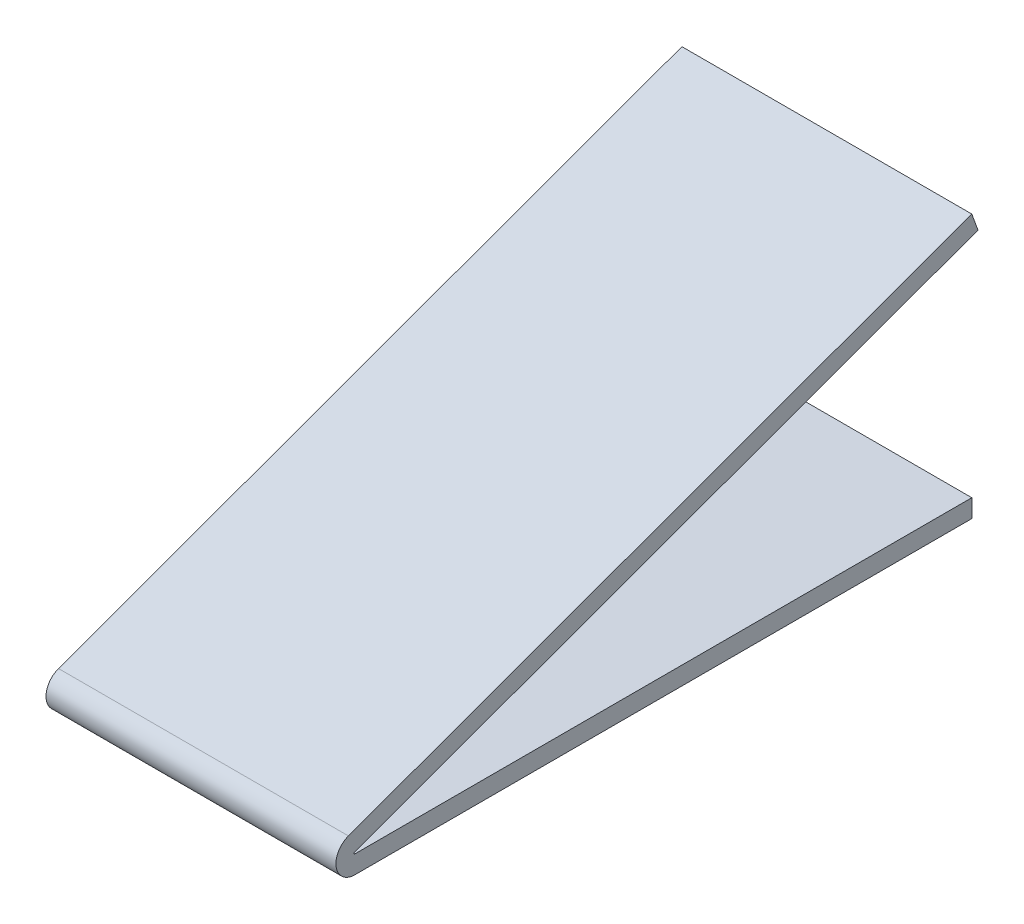
ISO-10303-21;
HEADER;
FILE_DESCRIPTION(('STEP AP214'),'2;1');
FILE_NAME('part.step','',(''),(''),'','','');
FILE_SCHEMA(('AUTOMOTIVE_DESIGN { 1 0 10303 214 1 1 1 1 }'));
ENDSEC;
DATA;
#1=APPLICATION_CONTEXT('core data for automotive mechanical design processes');
#2=APPLICATION_PROTOCOL_DEFINITION('international standard','automotive_design',2000,#1);
#3=PRODUCT_CONTEXT('',#1,'mechanical');
#4=PRODUCT('Part','Part','',(#3));
#5=PRODUCT_RELATED_PRODUCT_CATEGORY('part','',(#4));
#6=PRODUCT_DEFINITION_FORMATION('','',#4);
#7=PRODUCT_DEFINITION_CONTEXT('part definition',#1,'design');
#8=PRODUCT_DEFINITION('design','',#6,#7);
#9=PRODUCT_DEFINITION_SHAPE('','',#8);
#10=(LENGTH_UNIT() NAMED_UNIT(*) SI_UNIT(.MILLI.,.METRE.));
#11=(NAMED_UNIT(*) PLANE_ANGLE_UNIT() SI_UNIT($,.RADIAN.));
#12=(NAMED_UNIT(*) SI_UNIT($,.STERADIAN.) SOLID_ANGLE_UNIT());
#13=UNCERTAINTY_MEASURE_WITH_UNIT(LENGTH_MEASURE(1.E-05),#10,'distance_accuracy_value','');
#14=(GEOMETRIC_REPRESENTATION_CONTEXT(3) GLOBAL_UNCERTAINTY_ASSIGNED_CONTEXT((#13)) GLOBAL_UNIT_ASSIGNED_CONTEXT((#10,
#11,#12)) REPRESENTATION_CONTEXT('',''));
#15=CARTESIAN_POINT('',(0.,0.,0.));
#16=DIRECTION('',(0.,0.,1.));
#17=DIRECTION('',(1.,0.,0.));
#18=AXIS2_PLACEMENT_3D('',#15,#16,#17);
#19=CARTESIAN_POINT('',(8.,0.548492315519647,-2.96887245171615));
#20=DIRECTION('',(0.,0.939692620785908,0.342020143325669));
#21=DIRECTION('',(0.,-0.342020143325669,0.939692620785908));
#22=AXIS2_PLACEMENT_3D('',#19,#20,#21);
#23=PLANE('',#22);
#24=DIRECTION('',(0.,0.342020143325669,-0.939692620785908));
#25=VECTOR('',#24,1.);
#26=CARTESIAN_POINT('',(0.,0.548492315519647,-2.96887245171615));
#27=LINE('',#26,#25);
#28=CARTESIAN_POINT('',(0.,0.548492315519647,-2.96887245171615));
#29=VERTEX_POINT('',#28);
#30=CARTESIAN_POINT('',(0.,6.80955837493111,-20.1710100716628));
#31=VERTEX_POINT('',#30);
#32=EDGE_CURVE('E130',#29,#31,#27,.T.);
#33=ORIENTED_EDGE('',*,*,#32,.T.);
#34=DIRECTION('',(-1.,0.,0.));
#35=VECTOR('',#34,1.);
#36=CARTESIAN_POINT('',(8.,6.80955837493111,-20.1710100716628));
#37=LINE('',#36,#35);
#38=CARTESIAN_POINT('',(8.,6.80955837493111,-20.1710100716628));
#39=VERTEX_POINT('',#38);
#40=EDGE_CURVE('E11',#39,#31,#37,.T.);
#41=ORIENTED_EDGE('',*,*,#40,.F.);
#42=DIRECTION('',(0.,0.342020143325669,-0.939692620785908));
#43=VECTOR('',#42,1.);
#44=CARTESIAN_POINT('',(8.,0.548492315519647,-2.96887245171615));
#45=LINE('',#44,#43);
#46=CARTESIAN_POINT('',(8.,0.548492315519647,-2.96887245171615));
#47=VERTEX_POINT('',#46);
#48=EDGE_CURVE('E88',#47,#39,#45,.T.);
#49=ORIENTED_EDGE('',*,*,#48,.F.);
#50=DIRECTION('',(-1.,0.,0.));
#51=VECTOR('',#50,1.);
#52=CARTESIAN_POINT('',(8.,0.548492315519647,-2.96887245171615));
#53=LINE('',#52,#51);
#54=EDGE_CURVE('E129',#47,#29,#53,.T.);
#55=ORIENTED_EDGE('',*,*,#54,.T.);
#56=EDGE_LOOP('',(#33,#41,#49,#55));
#57=FACE_BOUND('',#56,.T.);
#58=ADVANCED_FACE('F33',(#57),#23,.F.);
#59=CARTESIAN_POINT('',(8.,7.27940468532406,-20.));
#60=DIRECTION('',(0.,0.342020143325676,-0.939692620785906));
#61=DIRECTION('',(0.,0.939692620785906,0.342020143325676));
#62=AXIS2_PLACEMENT_3D('',#59,#60,#61);
#63=PLANE('',#62);
#64=DIRECTION('',(0.,-0.939692620785906,-0.342020143325676));
#65=VECTOR('',#64,1.);
#66=CARTESIAN_POINT('',(0.,7.27940468532406,-20.));
#67=LINE('',#66,#65);
#68=CARTESIAN_POINT('',(0.,7.27940468532406,-20.));
#69=VERTEX_POINT('',#68);
#70=EDGE_CURVE('E133',#69,#31,#67,.T.);
#71=ORIENTED_EDGE('',*,*,#70,.F.);
#72=DIRECTION('',(-1.,0.,0.));
#73=VECTOR('',#72,1.);
#74=CARTESIAN_POINT('',(8.,7.27940468532406,-20.));
#75=LINE('',#74,#73);
#76=CARTESIAN_POINT('',(8.,7.27940468532406,-20.));
#77=VERTEX_POINT('',#76);
#78=EDGE_CURVE('E41',#77,#69,#75,.T.);
#79=ORIENTED_EDGE('',*,*,#78,.F.);
#80=DIRECTION('',(0.,-0.939692620785906,-0.342020143325676));
#81=VECTOR('',#80,1.);
#82=CARTESIAN_POINT('',(8.,7.27940468532406,-20.));
#83=LINE('',#82,#81);
#84=EDGE_CURVE('E172',#77,#39,#83,.T.);
#85=ORIENTED_EDGE('',*,*,#84,.T.);
#86=ORIENTED_EDGE('',*,*,#40,.T.);
#87=EDGE_LOOP('',(#71,#79,#85,#86));
#88=FACE_BOUND('',#87,.T.);
#89=ADVANCED_FACE('F163',(#88),#63,.T.);
#90=CARTESIAN_POINT('',(8.,1.0183386259126,-2.79786238005331));
#91=DIRECTION('',(0.,0.939692620785908,0.342020143325669));
#92=DIRECTION('',(0.,-0.342020143325669,0.939692620785908));
#93=AXIS2_PLACEMENT_3D('',#90,#91,#92);
#94=PLANE('',#93);
#95=DIRECTION('',(0.,0.342020143325669,-0.939692620785908));
#96=VECTOR('',#95,1.);
#97=CARTESIAN_POINT('',(0.,1.0183386259126,-2.79786238005331));
#98=LINE('',#97,#96);
#99=CARTESIAN_POINT('',(0.,1.0183386259126,-2.79786238005331));
#100=VERTEX_POINT('',#99);
#101=EDGE_CURVE('E136',#100,#69,#98,.T.);
#102=ORIENTED_EDGE('',*,*,#101,.F.);
#103=DIRECTION('',(-1.,0.,0.));
#104=VECTOR('',#103,1.);
#105=CARTESIAN_POINT('',(8.,1.0183386259126,-2.79786238005331));
#106=LINE('',#105,#104);
#107=CARTESIAN_POINT('',(8.,1.0183386259126,-2.79786238005331));
#108=VERTEX_POINT('',#107);
#109=EDGE_CURVE('E153',#108,#100,#106,.T.);
#110=ORIENTED_EDGE('',*,*,#109,.F.);
#111=DIRECTION('',(0.,0.342020143325669,-0.939692620785908));
#112=VECTOR('',#111,1.);
#113=CARTESIAN_POINT('',(8.,1.0183386259126,-2.79786238005331));
#114=LINE('',#113,#112);
#115=EDGE_CURVE('E160',#108,#77,#114,.T.);
#116=ORIENTED_EDGE('',*,*,#115,.T.);
#117=ORIENTED_EDGE('',*,*,#78,.T.);
#118=EDGE_LOOP('',(#102,#110,#116,#117));
#119=FACE_BOUND('',#118,.T.);
#120=ADVANCED_FACE('F158',(#119),#94,.T.);
#121=CARTESIAN_POINT('',(8.,0.525,-2.97742295529929));
#122=DIRECTION('',(-1.,0.,0.));
#123=DIRECTION('',(0.,0.,1.));
#124=AXIS2_PLACEMENT_3D('',#121,#122,#123);
#125=CYLINDRICAL_SURFACE('',#124,0.525);
#126=CARTESIAN_POINT('',(0.,0.525,-2.97742295529929));
#127=DIRECTION('',(-1.,0.,0.));
#128=DIRECTION('',(0.,0.,1.));
#129=AXIS2_PLACEMENT_3D('',#126,#127,#128);
#130=CIRCLE('',#129,0.525);
#131=CARTESIAN_POINT('',(0.,0.,-2.97742295529929));
#132=VERTEX_POINT('',#131);
#133=EDGE_CURVE('E139',#132,#100,#130,.T.);
#134=ORIENTED_EDGE('',*,*,#133,.F.);
#135=DIRECTION('',(-1.,0.,0.));
#136=VECTOR('',#135,1.);
#137=CARTESIAN_POINT('',(8.,0.,-2.97742295529929));
#138=LINE('',#137,#136);
#139=CARTESIAN_POINT('',(8.,0.,-2.97742295529929));
#140=VERTEX_POINT('',#139);
#141=EDGE_CURVE('E151',#140,#132,#138,.T.);
#142=ORIENTED_EDGE('',*,*,#141,.F.);
#143=CARTESIAN_POINT('',(8.,0.525,-2.97742295529929));
#144=DIRECTION('',(-1.,0.,0.));
#145=DIRECTION('',(0.,0.,1.));
#146=AXIS2_PLACEMENT_3D('',#143,#144,#145);
#147=CIRCLE('',#146,0.525);
#148=EDGE_CURVE('E124',#140,#108,#147,.T.);
#149=ORIENTED_EDGE('',*,*,#148,.T.);
#150=ORIENTED_EDGE('',*,*,#109,.T.);
#151=EDGE_LOOP('',(#134,#142,#149,#150));
#152=FACE_BOUND('',#151,.T.);
#153=ADVANCED_FACE('F170',(#152),#125,.T.);
#154=CARTESIAN_POINT('',(8.,0.,-2.97742295529929));
#155=DIRECTION('',(0.,-1.,0.));
#156=DIRECTION('',(0.,0.,-1.));
#157=AXIS2_PLACEMENT_3D('',#154,#155,#156);
#158=PLANE('',#157);
#159=DIRECTION('',(0.,0.,1.));
#160=VECTOR('',#159,1.);
#161=CARTESIAN_POINT('',(0.,0.,-2.97742295529929));
#162=LINE('',#161,#160);
#163=CARTESIAN_POINT('',(0.,0.,-20.));
#164=VERTEX_POINT('',#163);
#165=EDGE_CURVE('E142',#164,#132,#162,.T.);
#166=ORIENTED_EDGE('',*,*,#165,.F.);
#167=DIRECTION('',(-1.,0.,0.));
#168=VECTOR('',#167,1.);
#169=CARTESIAN_POINT('',(8.,0.,-20.));
#170=LINE('',#169,#168);
#171=CARTESIAN_POINT('',(8.,0.,-20.));
#172=VERTEX_POINT('',#171);
#173=EDGE_CURVE('E112',#172,#164,#170,.T.);
#174=ORIENTED_EDGE('',*,*,#173,.F.);
#175=DIRECTION('',(0.,0.,1.));
#176=VECTOR('',#175,1.);
#177=CARTESIAN_POINT('',(8.,0.,-2.97742295529929));
#178=LINE('',#177,#176);
#179=EDGE_CURVE('E122',#172,#140,#178,.T.);
#180=ORIENTED_EDGE('',*,*,#179,.T.);
#181=ORIENTED_EDGE('',*,*,#141,.T.);
#182=EDGE_LOOP('',(#166,#174,#180,#181));
#183=FACE_BOUND('',#182,.T.);
#184=ADVANCED_FACE('F177',(#183),#158,.T.);
#185=CARTESIAN_POINT('',(8.,0.5,-20.));
#186=DIRECTION('',(0.,0.,-1.));
#187=DIRECTION('',(0.,1.,0.));
#188=AXIS2_PLACEMENT_3D('',#185,#186,#187);
#189=PLANE('',#188);
#190=DIRECTION('',(0.,-1.,0.));
#191=VECTOR('',#190,1.);
#192=CARTESIAN_POINT('',(0.,0.5,-20.));
#193=LINE('',#192,#191);
#194=CARTESIAN_POINT('',(0.,0.5,-20.));
#195=VERTEX_POINT('',#194);
#196=EDGE_CURVE('E111',#195,#164,#193,.T.);
#197=ORIENTED_EDGE('',*,*,#196,.F.);
#198=DIRECTION('',(-1.,0.,0.));
#199=VECTOR('',#198,1.);
#200=CARTESIAN_POINT('',(8.,0.5,-20.));
#201=LINE('',#200,#199);
#202=CARTESIAN_POINT('',(8.,0.5,-20.));
#203=VERTEX_POINT('',#202);
#204=EDGE_CURVE('E105',#203,#195,#201,.T.);
#205=ORIENTED_EDGE('',*,*,#204,.F.);
#206=DIRECTION('',(0.,-1.,0.));
#207=VECTOR('',#206,1.);
#208=CARTESIAN_POINT('',(8.,0.5,-20.));
#209=LINE('',#208,#207);
#210=EDGE_CURVE('E109',#203,#172,#209,.T.);
#211=ORIENTED_EDGE('',*,*,#210,.T.);
#212=ORIENTED_EDGE('',*,*,#173,.T.);
#213=EDGE_LOOP('',(#197,#205,#211,#212));
#214=FACE_BOUND('',#213,.T.);
#215=ADVANCED_FACE('F107',(#214),#189,.T.);
#216=CARTESIAN_POINT('',(8.,0.5,-2.97742295529929));
#217=DIRECTION('',(0.,-1.,0.));
#218=DIRECTION('',(0.,0.,-1.));
#219=AXIS2_PLACEMENT_3D('',#216,#217,#218);
#220=PLANE('',#219);
#221=DIRECTION('',(0.,0.,-1.));
#222=VECTOR('',#221,1.);
#223=CARTESIAN_POINT('',(0.,0.5,-2.97742295529929));
#224=LINE('',#223,#222);
#225=CARTESIAN_POINT('',(0.,0.5,-2.97742295529929));
#226=VERTEX_POINT('',#225);
#227=EDGE_CURVE('E76',#195,#226,#224,.F.);
#228=ORIENTED_EDGE('',*,*,#227,.T.);
#229=DIRECTION('',(-1.,0.,0.));
#230=VECTOR('',#229,1.);
#231=CARTESIAN_POINT('',(8.,0.5,-2.97742295529929));
#232=LINE('',#231,#230);
#233=CARTESIAN_POINT('',(8.,0.5,-2.97742295529929));
#234=VERTEX_POINT('',#233);
#235=EDGE_CURVE('E113',#234,#226,#232,.T.);
#236=ORIENTED_EDGE('',*,*,#235,.F.);
#237=DIRECTION('',(0.,0.,-1.));
#238=VECTOR('',#237,1.);
#239=CARTESIAN_POINT('',(8.,0.5,-2.97742295529929));
#240=LINE('',#239,#238);
#241=EDGE_CURVE('E115',#203,#234,#240,.F.);
#242=ORIENTED_EDGE('',*,*,#241,.F.);
#243=ORIENTED_EDGE('',*,*,#204,.T.);
#244=EDGE_LOOP('',(#228,#236,#242,#243));
#245=FACE_BOUND('',#244,.T.);
#246=ADVANCED_FACE('F116',(#245),#220,.F.);
#247=CARTESIAN_POINT('',(8.,0.525,-2.97742295529929));
#248=DIRECTION('',(-1.,0.,0.));
#249=DIRECTION('',(0.,0.,1.));
#250=AXIS2_PLACEMENT_3D('',#247,#248,#249);
#251=CYLINDRICAL_SURFACE('',#250,0.0250000000000001);
#252=CARTESIAN_POINT('',(0.,0.525,-2.97742295529929));
#253=DIRECTION('',(1.,0.,0.));
#254=DIRECTION('',(0.,0.,-1.));
#255=AXIS2_PLACEMENT_3D('',#252,#253,#254);
#256=CIRCLE('',#255,0.0250000000000001);
#257=EDGE_CURVE('E82',#226,#29,#256,.F.);
#258=ORIENTED_EDGE('',*,*,#257,.T.);
#259=ORIENTED_EDGE('',*,*,#54,.F.);
#260=CARTESIAN_POINT('',(8.,0.525,-2.97742295529929));
#261=DIRECTION('',(1.,0.,0.));
#262=DIRECTION('',(0.,0.,-1.));
#263=AXIS2_PLACEMENT_3D('',#260,#261,#262);
#264=CIRCLE('',#263,0.0250000000000001);
#265=EDGE_CURVE('E49',#234,#47,#264,.F.);
#266=ORIENTED_EDGE('',*,*,#265,.F.);
#267=ORIENTED_EDGE('',*,*,#235,.T.);
#268=EDGE_LOOP('',(#258,#259,#266,#267));
#269=FACE_BOUND('',#268,.T.);
#270=ADVANCED_FACE('F179',(#269),#251,.F.);
#271=CARTESIAN_POINT('',(8.,0.525,-2.97742295529929));
#272=DIRECTION('',(-1.,0.,0.));
#273=DIRECTION('',(0.,0.,1.));
#274=AXIS2_PLACEMENT_3D('',#271,#272,#273);
#275=PLANE('',#274);
#276=ORIENTED_EDGE('',*,*,#48,.T.);
#277=ORIENTED_EDGE('',*,*,#84,.F.);
#278=ORIENTED_EDGE('',*,*,#115,.F.);
#279=ORIENTED_EDGE('',*,*,#148,.F.);
#280=ORIENTED_EDGE('',*,*,#179,.F.);
#281=ORIENTED_EDGE('',*,*,#210,.F.);
#282=ORIENTED_EDGE('',*,*,#241,.T.);
#283=ORIENTED_EDGE('',*,*,#265,.T.);
#284=EDGE_LOOP('',(#276,#277,#278,#279,#280,#281,#282,#283));
#285=FACE_BOUND('',#284,.T.);
#286=ADVANCED_FACE('F119',(#285),#275,.F.);
#287=CARTESIAN_POINT('',(0.,0.525,-2.97742295529929));
#288=DIRECTION('',(-1.,0.,0.));
#289=DIRECTION('',(0.,0.,1.));
#290=AXIS2_PLACEMENT_3D('',#287,#288,#289);
#291=PLANE('',#290);
#292=ORIENTED_EDGE('',*,*,#32,.F.);
#293=ORIENTED_EDGE('',*,*,#257,.F.);
#294=ORIENTED_EDGE('',*,*,#227,.F.);
#295=ORIENTED_EDGE('',*,*,#196,.T.);
#296=ORIENTED_EDGE('',*,*,#165,.T.);
#297=ORIENTED_EDGE('',*,*,#133,.T.);
#298=ORIENTED_EDGE('',*,*,#101,.T.);
#299=ORIENTED_EDGE('',*,*,#70,.T.);
#300=EDGE_LOOP('',(#292,#293,#294,#295,#296,#297,#298,#299));
#301=FACE_BOUND('',#300,.T.);
#302=ADVANCED_FACE('F166',(#301),#291,.T.);
#303=CLOSED_SHELL('',(#58,#89,#120,#153,#184,#215,#246,#270,#286,#302));
#304=MANIFOLD_SOLID_BREP('B2',#303);
#305=ADVANCED_BREP_SHAPE_REPRESENTATION('',(#18,#304),#14);
#306=SHAPE_DEFINITION_REPRESENTATION(#9,#305);
ENDSEC;
END-ISO-10303-21;
